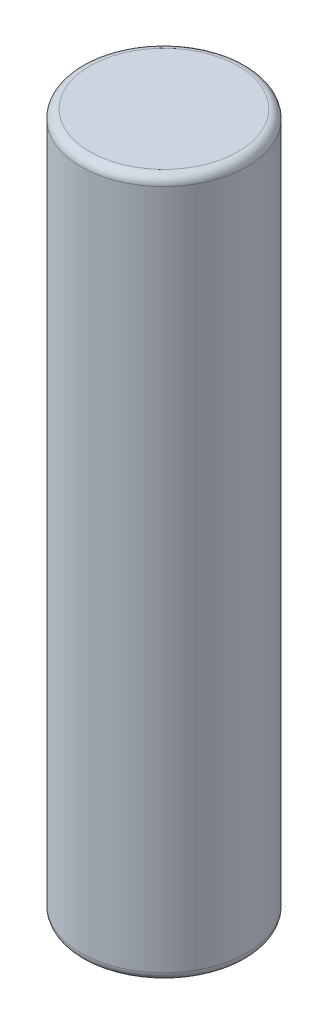
ISO-10303-21;
HEADER;
FILE_DESCRIPTION(('STEP AP214'),'2;1');
FILE_NAME('part.step','',(''),(''),'','','');
FILE_SCHEMA(('AUTOMOTIVE_DESIGN { 1 0 10303 214 1 1 1 1 }'));
ENDSEC;
DATA;
#1=APPLICATION_CONTEXT('core data for automotive mechanical design processes');
#2=APPLICATION_PROTOCOL_DEFINITION('international standard','automotive_design',2000,#1);
#3=PRODUCT_CONTEXT('',#1,'mechanical');
#4=PRODUCT('Part','Part','',(#3));
#5=PRODUCT_RELATED_PRODUCT_CATEGORY('part','',(#4));
#6=PRODUCT_DEFINITION_FORMATION('','',#4);
#7=PRODUCT_DEFINITION_CONTEXT('part definition',#1,'design');
#8=PRODUCT_DEFINITION('design','',#6,#7);
#9=PRODUCT_DEFINITION_SHAPE('','',#8);
#10=(LENGTH_UNIT() NAMED_UNIT(*) SI_UNIT(.MILLI.,.METRE.));
#11=(NAMED_UNIT(*) PLANE_ANGLE_UNIT() SI_UNIT($,.RADIAN.));
#12=(NAMED_UNIT(*) SI_UNIT($,.STERADIAN.) SOLID_ANGLE_UNIT());
#13=UNCERTAINTY_MEASURE_WITH_UNIT(LENGTH_MEASURE(1.E-05),#10,'distance_accuracy_value','');
#14=(GEOMETRIC_REPRESENTATION_CONTEXT(3) GLOBAL_UNCERTAINTY_ASSIGNED_CONTEXT((#13)) GLOBAL_UNIT_ASSIGNED_CONTEXT((#10,
#11,#12)) REPRESENTATION_CONTEXT('',''));
#15=CARTESIAN_POINT('',(0.,0.,0.));
#16=DIRECTION('',(0.,0.,1.));
#17=DIRECTION('',(1.,0.,0.));
#18=AXIS2_PLACEMENT_3D('',#15,#16,#17);
#19=CARTESIAN_POINT('',(0.,80.,0.));
#20=DIRECTION('',(0.,-1.,0.));
#21=DIRECTION('',(0.,0.,-1.));
#22=AXIS2_PLACEMENT_3D('',#19,#20,#21);
#23=CYLINDRICAL_SURFACE('',#22,9.5);
#24=CARTESIAN_POINT('',(0.,1.,0.));
#25=DIRECTION('',(0.,1.,0.));
#26=DIRECTION('',(0.,0.,1.));
#27=AXIS2_PLACEMENT_3D('',#24,#25,#26);
#28=CIRCLE('',#27,9.5);
#29=CARTESIAN_POINT('',(0.,1.,9.5));
#30=VERTEX_POINT('',#29);
#31=EDGE_CURVE('E50',#30,#30,#28,.T.);
#32=ORIENTED_EDGE('',*,*,#31,.T.);
#33=EDGE_LOOP('',(#32));
#34=FACE_BOUND('',#33,.T.);
#35=CARTESIAN_POINT('',(0.,79.,0.));
#36=DIRECTION('',(0.,1.,0.));
#37=DIRECTION('',(0.,0.,1.));
#38=AXIS2_PLACEMENT_3D('',#35,#36,#37);
#39=CIRCLE('',#38,9.5);
#40=CARTESIAN_POINT('',(0.,79.,9.5));
#41=VERTEX_POINT('',#40);
#42=EDGE_CURVE('E54',#41,#41,#39,.F.);
#43=ORIENTED_EDGE('',*,*,#42,.T.);
#44=EDGE_LOOP('',(#43));
#45=FACE_BOUND('',#44,.T.);
#46=ADVANCED_FACE('F39',(#34,#45),#23,.T.);
#47=CARTESIAN_POINT('',(0.,80.,0.));
#48=DIRECTION('',(0.,1.,0.));
#49=DIRECTION('',(0.,0.,1.));
#50=AXIS2_PLACEMENT_3D('',#47,#48,#49);
#51=PLANE('',#50);
#52=CARTESIAN_POINT('',(0.,80.,0.));
#53=DIRECTION('',(0.,1.,0.));
#54=DIRECTION('',(0.,0.,1.));
#55=AXIS2_PLACEMENT_3D('',#52,#53,#54);
#56=CIRCLE('',#55,8.5);
#57=CARTESIAN_POINT('',(0.,80.,8.5));
#58=VERTEX_POINT('',#57);
#59=EDGE_CURVE('E10',#58,#58,#56,.T.);
#60=ORIENTED_EDGE('',*,*,#59,.T.);
#61=EDGE_LOOP('',(#60));
#62=FACE_BOUND('',#61,.T.);
#63=ADVANCED_FACE('F70',(#62),#51,.T.);
#64=CARTESIAN_POINT('',(0.,0.,0.));
#65=DIRECTION('',(0.,1.,0.));
#66=DIRECTION('',(0.,0.,1.));
#67=AXIS2_PLACEMENT_3D('',#64,#65,#66);
#68=PLANE('',#67);
#69=CARTESIAN_POINT('',(0.,0.,0.));
#70=DIRECTION('',(0.,1.,0.));
#71=DIRECTION('',(0.,0.,1.));
#72=AXIS2_PLACEMENT_3D('',#69,#70,#71);
#73=CIRCLE('',#72,8.5);
#74=CARTESIAN_POINT('',(0.,0.,8.5));
#75=VERTEX_POINT('',#74);
#76=EDGE_CURVE('E46',#75,#75,#73,.F.);
#77=ORIENTED_EDGE('',*,*,#76,.T.);
#78=EDGE_LOOP('',(#77));
#79=FACE_BOUND('',#78,.T.);
#80=ADVANCED_FACE('F67',(#79),#68,.F.);
#81=CARTESIAN_POINT('',(0.,1.,0.));
#82=DIRECTION('',(0.,1.,0.));
#83=DIRECTION('',(0.,0.,1.));
#84=AXIS2_PLACEMENT_3D('',#81,#82,#83);
#85=TOROIDAL_SURFACE('',#84,8.5,1.);
#86=ORIENTED_EDGE('',*,*,#76,.F.);
#87=EDGE_LOOP('',(#86));
#88=FACE_BOUND('',#87,.T.);
#89=ORIENTED_EDGE('',*,*,#31,.F.);
#90=EDGE_LOOP('',(#89));
#91=FACE_BOUND('',#90,.T.);
#92=ADVANCED_FACE('F63',(#88,#91),#85,.T.);
#93=CARTESIAN_POINT('',(0.,79.,0.));
#94=DIRECTION('',(0.,1.,0.));
#95=DIRECTION('',(0.,0.,1.));
#96=AXIS2_PLACEMENT_3D('',#93,#94,#95);
#97=TOROIDAL_SURFACE('',#96,8.5,1.);
#98=ORIENTED_EDGE('',*,*,#42,.F.);
#99=EDGE_LOOP('',(#98));
#100=FACE_BOUND('',#99,.T.);
#101=ORIENTED_EDGE('',*,*,#59,.F.);
#102=EDGE_LOOP('',(#101));
#103=FACE_BOUND('',#102,.T.);
#104=ADVANCED_FACE('F41',(#100,#103),#97,.T.);
#105=CLOSED_SHELL('',(#46,#63,#80,#92,#104));
#106=MANIFOLD_SOLID_BREP('B2',#105);
#107=ADVANCED_BREP_SHAPE_REPRESENTATION('',(#18,#106),#14);
#108=SHAPE_DEFINITION_REPRESENTATION(#9,#107);
ENDSEC;
END-ISO-10303-21;
